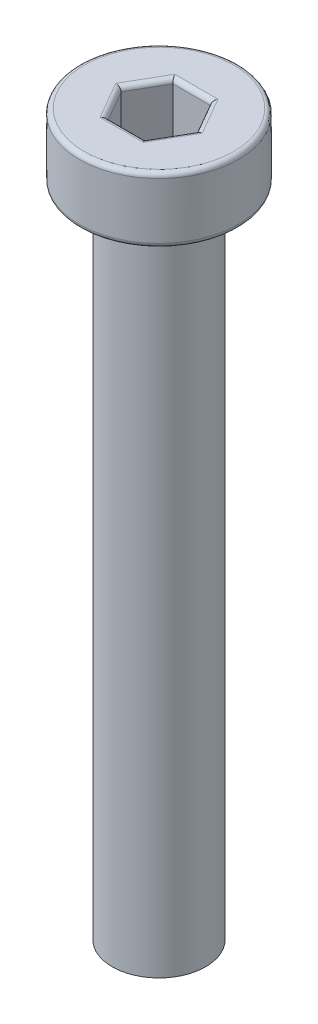
ISO-10303-21;
HEADER;
FILE_DESCRIPTION(('STEP AP214'),'2;1');
FILE_NAME('part.step','',(''),(''),'','','');
FILE_SCHEMA(('AUTOMOTIVE_DESIGN { 1 0 10303 214 1 1 1 1 }'));
ENDSEC;
DATA;
#1=APPLICATION_CONTEXT('core data for automotive mechanical design processes');
#2=APPLICATION_PROTOCOL_DEFINITION('international standard','automotive_design',2000,#1);
#3=PRODUCT_CONTEXT('',#1,'mechanical');
#4=PRODUCT('Part','Part','',(#3));
#5=PRODUCT_RELATED_PRODUCT_CATEGORY('part','',(#4));
#6=PRODUCT_DEFINITION_FORMATION('','',#4);
#7=PRODUCT_DEFINITION_CONTEXT('part definition',#1,'design');
#8=PRODUCT_DEFINITION('design','',#6,#7);
#9=PRODUCT_DEFINITION_SHAPE('','',#8);
#10=(LENGTH_UNIT() NAMED_UNIT(*) SI_UNIT(.MILLI.,.METRE.));
#11=(NAMED_UNIT(*) PLANE_ANGLE_UNIT() SI_UNIT($,.RADIAN.));
#12=(NAMED_UNIT(*) SI_UNIT($,.STERADIAN.) SOLID_ANGLE_UNIT());
#13=UNCERTAINTY_MEASURE_WITH_UNIT(LENGTH_MEASURE(1.E-05),#10,'distance_accuracy_value','');
#14=(GEOMETRIC_REPRESENTATION_CONTEXT(3) GLOBAL_UNCERTAINTY_ASSIGNED_CONTEXT((#13)) GLOBAL_UNIT_ASSIGNED_CONTEXT((#10,
#11,#12)) REPRESENTATION_CONTEXT('',''));
#15=CARTESIAN_POINT('',(0.,0.,0.));
#16=DIRECTION('',(0.,0.,1.));
#17=DIRECTION('',(1.,0.,0.));
#18=AXIS2_PLACEMENT_3D('',#15,#16,#17);
#19=CARTESIAN_POINT('',(2.45065328235741E-11,3.5,0.));
#20=DIRECTION('',(0.,-1.,0.));
#21=DIRECTION('',(1.,0.,0.));
#22=AXIS2_PLACEMENT_3D('',#19,#20,#21);
#23=PLANE('',#22);
#24=CARTESIAN_POINT('',(0.,3.5,0.));
#25=DIRECTION('',(0.,-1.,0.));
#26=DIRECTION('',(1.,0.,0.));
#27=AXIS2_PLACEMENT_3D('',#24,#25,#26);
#28=CIRCLE('',#27,4.0000000000245);
#29=CARTESIAN_POINT('',(4.0000000000245,3.5,0.));
#30=VERTEX_POINT('',#29);
#31=EDGE_CURVE('E179',#30,#30,#28,.F.);
#32=ORIENTED_EDGE('',*,*,#31,.T.);
#33=EDGE_LOOP('',(#32));
#34=FACE_BOUND('',#33,.T.);
#35=DIRECTION('',(-0.5,0.,0.866025403784439));
#36=VECTOR('',#35,1.);
#37=CARTESIAN_POINT('',(-1.73205080756275,3.5,-1.00000000001061));
#38=LINE('',#37,#36);
#39=CARTESIAN_POINT('',(-2.3094010767585,3.5,0.));
#40=VERTEX_POINT('',#39);
#41=CARTESIAN_POINT('',(-1.15470053837925,3.5,-2.));
#42=VERTEX_POINT('',#41);
#43=EDGE_CURVE('E174',#40,#42,#38,.F.);
#44=ORIENTED_EDGE('',*,*,#43,.T.);
#45=DIRECTION('',(-1.,0.,0.));
#46=VECTOR('',#45,1.);
#47=CARTESIAN_POINT('',(2.45071766726879E-11,3.5,-2.));
#48=LINE('',#47,#46);
#49=CARTESIAN_POINT('',(1.15470053837925,3.5,-2.));
#50=VERTEX_POINT('',#49);
#51=EDGE_CURVE('E176',#42,#50,#48,.F.);
#52=ORIENTED_EDGE('',*,*,#51,.T.);
#53=DIRECTION('',(-0.5,0.,-0.866025403784439));
#54=VECTOR('',#53,1.);
#55=CARTESIAN_POINT('',(1.732050807575,3.5,-0.999999999989388));
#56=LINE('',#55,#54);
#57=CARTESIAN_POINT('',(2.3094010767585,3.5,0.));
#58=VERTEX_POINT('',#57);
#59=EDGE_CURVE('E166',#50,#58,#56,.F.);
#60=ORIENTED_EDGE('',*,*,#59,.T.);
#61=DIRECTION('',(0.5,0.,-0.866025403784439));
#62=VECTOR('',#61,1.);
#63=CARTESIAN_POINT('',(1.732050807575,3.5,0.999999999989388));
#64=LINE('',#63,#62);
#65=CARTESIAN_POINT('',(1.15470053837925,3.5,2.));
#66=VERTEX_POINT('',#65);
#67=EDGE_CURVE('E168',#58,#66,#64,.F.);
#68=ORIENTED_EDGE('',*,*,#67,.T.);
#69=DIRECTION('',(1.,0.,0.));
#70=VECTOR('',#69,1.);
#71=CARTESIAN_POINT('',(2.45054597417179E-11,3.5,2.));
#72=LINE('',#71,#70);
#73=CARTESIAN_POINT('',(-1.15470053837925,3.5,2.));
#74=VERTEX_POINT('',#73);
#75=EDGE_CURVE('E170',#66,#74,#72,.F.);
#76=ORIENTED_EDGE('',*,*,#75,.T.);
#77=DIRECTION('',(0.5,0.,0.866025403784439));
#78=VECTOR('',#77,1.);
#79=CARTESIAN_POINT('',(-1.73205080756275,3.5,1.00000000001061));
#80=LINE('',#79,#78);
#81=EDGE_CURVE('E172',#74,#40,#80,.F.);
#82=ORIENTED_EDGE('',*,*,#81,.T.);
#83=EDGE_LOOP('',(#44,#52,#60,#68,#76,#82));
#84=FACE_BOUND('',#83,.T.);
#85=ADVANCED_FACE('F33',(#34,#84),#23,.F.);
#86=CARTESIAN_POINT('',(0.,21.3223243250921,0.));
#87=DIRECTION('',(0.,1.,0.));
#88=DIRECTION('',(-1.,0.,0.));
#89=AXIS2_PLACEMENT_3D('',#86,#87,#88);
#90=CYLINDRICAL_SURFACE('',#89,4.2500000000245);
#91=CARTESIAN_POINT('',(0.,0.25,0.));
#92=DIRECTION('',(0.,1.,0.));
#93=DIRECTION('',(-1.,0.,0.));
#94=AXIS2_PLACEMENT_3D('',#91,#92,#93);
#95=CIRCLE('',#94,4.2500000000245);
#96=CARTESIAN_POINT('',(-4.2500000000245,0.25,0.));
#97=VERTEX_POINT('',#96);
#98=EDGE_CURVE('E163',#97,#97,#95,.T.);
#99=ORIENTED_EDGE('',*,*,#98,.T.);
#100=EDGE_LOOP('',(#99));
#101=FACE_BOUND('',#100,.T.);
#102=CARTESIAN_POINT('',(0.,3.25,0.));
#103=DIRECTION('',(0.,-1.,0.));
#104=DIRECTION('',(1.,0.,0.));
#105=AXIS2_PLACEMENT_3D('',#102,#103,#104);
#106=CIRCLE('',#105,4.2500000000245);
#107=CARTESIAN_POINT('',(4.2500000000245,3.25,0.));
#108=VERTEX_POINT('',#107);
#109=EDGE_CURVE('E160',#108,#108,#106,.T.);
#110=ORIENTED_EDGE('',*,*,#109,.T.);
#111=EDGE_LOOP('',(#110));
#112=FACE_BOUND('',#111,.T.);
#113=ADVANCED_FACE('F240',(#101,#112),#90,.T.);
#114=CARTESIAN_POINT('',(4.2500000000245,0.,0.));
#115=DIRECTION('',(0.,1.,0.));
#116=DIRECTION('',(-1.,0.,0.));
#117=AXIS2_PLACEMENT_3D('',#114,#115,#116);
#118=PLANE('',#117);
#119=CARTESIAN_POINT('',(0.,0.,0.));
#120=DIRECTION('',(0.,1.,0.));
#121=DIRECTION('',(-1.,0.,0.));
#122=AXIS2_PLACEMENT_3D('',#119,#120,#121);
#123=CIRCLE('',#122,2.74999999997329);
#124=CARTESIAN_POINT('',(-2.74999999997329,0.,0.));
#125=VERTEX_POINT('',#124);
#126=EDGE_CURVE('E154',#125,#125,#123,.T.);
#127=ORIENTED_EDGE('',*,*,#126,.T.);
#128=EDGE_LOOP('',(#127));
#129=FACE_BOUND('',#128,.T.);
#130=CARTESIAN_POINT('',(0.,0.,0.));
#131=DIRECTION('',(0.,1.,0.));
#132=DIRECTION('',(-1.,0.,0.));
#133=AXIS2_PLACEMENT_3D('',#130,#131,#132);
#134=CIRCLE('',#133,4.0000000000245);
#135=CARTESIAN_POINT('',(-4.0000000000245,0.,0.));
#136=VERTEX_POINT('',#135);
#137=EDGE_CURVE('E151',#136,#136,#134,.F.);
#138=ORIENTED_EDGE('',*,*,#137,.T.);
#139=EDGE_LOOP('',(#138));
#140=FACE_BOUND('',#139,.T.);
#141=ADVANCED_FACE('F246',(#129,#140),#118,.F.);
#142=CARTESIAN_POINT('',(0.,21.3223243250921,0.));
#143=DIRECTION('',(0.,1.,0.));
#144=DIRECTION('',(-1.,0.,0.));
#145=AXIS2_PLACEMENT_3D('',#142,#143,#144);
#146=CYLINDRICAL_SURFACE('',#145,2.49999999997329);
#147=CARTESIAN_POINT('',(0.,-0.25,0.));
#148=DIRECTION('',(0.,1.,0.));
#149=DIRECTION('',(-1.,0.,0.));
#150=AXIS2_PLACEMENT_3D('',#147,#148,#149);
#151=CIRCLE('',#150,2.49999999997329);
#152=CARTESIAN_POINT('',(-2.49999999997329,-0.250000000000001,0.));
#153=VERTEX_POINT('',#152);
#154=EDGE_CURVE('E157',#153,#153,#151,.F.);
#155=ORIENTED_EDGE('',*,*,#154,.T.);
#156=EDGE_LOOP('',(#155));
#157=FACE_BOUND('',#156,.T.);
#158=CARTESIAN_POINT('',(0.,-35.,0.));
#159=DIRECTION('',(0.,1.,0.));
#160=DIRECTION('',(-1.,0.,0.));
#161=AXIS2_PLACEMENT_3D('',#158,#159,#160);
#162=CIRCLE('',#161,2.4999999999733);
#163=CARTESIAN_POINT('',(-2.49999999997329,-35.,0.));
#164=VERTEX_POINT('',#163);
#165=EDGE_CURVE('E139',#164,#164,#162,.T.);
#166=ORIENTED_EDGE('',*,*,#165,.T.);
#167=EDGE_LOOP('',(#166));
#168=FACE_BOUND('',#167,.T.);
#169=ADVANCED_FACE('F338',(#157,#168),#146,.T.);
#170=CARTESIAN_POINT('',(2.49999999997331,-35.,0.));
#171=DIRECTION('',(0.,1.,0.));
#172=DIRECTION('',(-1.,0.,0.));
#173=AXIS2_PLACEMENT_3D('',#170,#171,#172);
#174=PLANE('',#173);
#175=ORIENTED_EDGE('',*,*,#165,.F.);
#176=EDGE_LOOP('',(#175));
#177=FACE_BOUND('',#176,.T.);
#178=ADVANCED_FACE('F236',(#177),#174,.F.);
#179=CARTESIAN_POINT('',(1.01036297108184,0.5,1.75));
#180=DIRECTION('',(0.866025403784439,0.,0.5));
#181=DIRECTION('',(0.5,0.,-0.866025403784439));
#182=AXIS2_PLACEMENT_3D('',#179,#180,#181);
#183=PLANE('',#182);
#184=DIRECTION('',(0.,1.,0.));
#185=VECTOR('',#184,1.);
#186=CARTESIAN_POINT('',(1.01036297108184,0.5,1.75));
#187=LINE('',#186,#185);
#188=CARTESIAN_POINT('',(1.01036297108184,0.5,1.75));
#189=VERTEX_POINT('',#188);
#190=CARTESIAN_POINT('',(1.01036297108184,3.25,1.75));
#191=VERTEX_POINT('',#190);
#192=EDGE_CURVE('E137',#189,#191,#187,.T.);
#193=ORIENTED_EDGE('',*,*,#192,.T.);
#194=DIRECTION('',(0.5,0.,-0.866025403784439));
#195=VECTOR('',#194,1.);
#196=CARTESIAN_POINT('',(1.01036297108184,3.25,1.75));
#197=LINE('',#196,#195);
#198=CARTESIAN_POINT('',(2.02072594216369,3.25,0.));
#199=VERTEX_POINT('',#198);
#200=EDGE_CURVE('E42',#191,#199,#197,.T.);
#201=ORIENTED_EDGE('',*,*,#200,.T.);
#202=DIRECTION('',(0.,1.,0.));
#203=VECTOR('',#202,1.);
#204=CARTESIAN_POINT('',(2.02072594216369,0.5,0.));
#205=LINE('',#204,#203);
#206=CARTESIAN_POINT('',(2.02072594216369,0.5,0.));
#207=VERTEX_POINT('',#206);
#208=EDGE_CURVE('E103',#207,#199,#205,.T.);
#209=ORIENTED_EDGE('',*,*,#208,.F.);
#210=DIRECTION('',(0.5,0.,-0.866025403784439));
#211=VECTOR('',#210,1.);
#212=CARTESIAN_POINT('',(1.01036297108184,0.5,1.75));
#213=LINE('',#212,#211);
#214=EDGE_CURVE('E107',#189,#207,#213,.T.);
#215=ORIENTED_EDGE('',*,*,#214,.F.);
#216=EDGE_LOOP('',(#193,#201,#209,#215));
#217=FACE_BOUND('',#216,.T.);
#218=ADVANCED_FACE('F105',(#217),#183,.F.);
#219=CARTESIAN_POINT('',(-1.01036297108185,0.5,1.75));
#220=DIRECTION('',(0.,0.,1.));
#221=DIRECTION('',(1.,0.,0.));
#222=AXIS2_PLACEMENT_3D('',#219,#220,#221);
#223=PLANE('',#222);
#224=DIRECTION('',(0.,1.,0.));
#225=VECTOR('',#224,1.);
#226=CARTESIAN_POINT('',(-1.01036297108185,0.5,1.75));
#227=LINE('',#226,#225);
#228=CARTESIAN_POINT('',(-1.01036297108185,0.5,1.75));
#229=VERTEX_POINT('',#228);
#230=CARTESIAN_POINT('',(-1.01036297108185,3.25,1.75));
#231=VERTEX_POINT('',#230);
#232=EDGE_CURVE('E140',#229,#231,#227,.T.);
#233=ORIENTED_EDGE('',*,*,#232,.T.);
#234=DIRECTION('',(1.,0.,0.));
#235=VECTOR('',#234,1.);
#236=CARTESIAN_POINT('',(-1.01036297108185,3.25,1.75));
#237=LINE('',#236,#235);
#238=EDGE_CURVE('E57',#231,#191,#237,.T.);
#239=ORIENTED_EDGE('',*,*,#238,.T.);
#240=ORIENTED_EDGE('',*,*,#192,.F.);
#241=DIRECTION('',(1.,0.,0.));
#242=VECTOR('',#241,1.);
#243=CARTESIAN_POINT('',(-1.01036297108185,0.5,1.75));
#244=LINE('',#243,#242);
#245=EDGE_CURVE('E112',#229,#189,#244,.T.);
#246=ORIENTED_EDGE('',*,*,#245,.F.);
#247=EDGE_LOOP('',(#233,#239,#240,#246));
#248=FACE_BOUND('',#247,.T.);
#249=ADVANCED_FACE('F228',(#248),#223,.F.);
#250=CARTESIAN_POINT('',(-2.02072594216369,0.499999999999999,0.));
#251=DIRECTION('',(-0.866025403784439,0.,0.5));
#252=DIRECTION('',(0.5,0.,0.866025403784439));
#253=AXIS2_PLACEMENT_3D('',#250,#251,#252);
#254=PLANE('',#253);
#255=DIRECTION('',(0.,1.,0.));
#256=VECTOR('',#255,1.);
#257=CARTESIAN_POINT('',(-2.02072594216369,0.499999999999999,0.));
#258=LINE('',#257,#256);
#259=CARTESIAN_POINT('',(-2.02072594216369,0.499999999999999,0.));
#260=VERTEX_POINT('',#259);
#261=CARTESIAN_POINT('',(-2.02072594216369,3.25,0.));
#262=VERTEX_POINT('',#261);
#263=EDGE_CURVE('E142',#260,#262,#258,.T.);
#264=ORIENTED_EDGE('',*,*,#263,.T.);
#265=DIRECTION('',(0.5,0.,0.866025403784439));
#266=VECTOR('',#265,1.);
#267=CARTESIAN_POINT('',(-2.02072594216369,3.25,0.));
#268=LINE('',#267,#266);
#269=EDGE_CURVE('E187',#262,#231,#268,.T.);
#270=ORIENTED_EDGE('',*,*,#269,.T.);
#271=ORIENTED_EDGE('',*,*,#232,.F.);
#272=DIRECTION('',(0.5,0.,0.866025403784439));
#273=VECTOR('',#272,1.);
#274=CARTESIAN_POINT('',(-2.02072594216369,0.499999999999999,0.));
#275=LINE('',#274,#273);
#276=EDGE_CURVE('E134',#260,#229,#275,.T.);
#277=ORIENTED_EDGE('',*,*,#276,.F.);
#278=EDGE_LOOP('',(#264,#270,#271,#277));
#279=FACE_BOUND('',#278,.T.);
#280=ADVANCED_FACE('F227',(#279),#254,.F.);
#281=CARTESIAN_POINT('',(-1.01036297108185,0.5,-1.75));
#282=DIRECTION('',(-0.866025403784439,0.,-0.5));
#283=DIRECTION('',(-0.5,0.,0.866025403784439));
#284=AXIS2_PLACEMENT_3D('',#281,#282,#283);
#285=PLANE('',#284);
#286=DIRECTION('',(0.,1.,0.));
#287=VECTOR('',#286,1.);
#288=CARTESIAN_POINT('',(-1.01036297108185,0.5,-1.75));
#289=LINE('',#288,#287);
#290=CARTESIAN_POINT('',(-1.01036297108185,0.5,-1.75));
#291=VERTEX_POINT('',#290);
#292=CARTESIAN_POINT('',(-1.01036297108185,3.25,-1.75));
#293=VERTEX_POINT('',#292);
#294=EDGE_CURVE('E145',#291,#293,#289,.T.);
#295=ORIENTED_EDGE('',*,*,#294,.T.);
#296=DIRECTION('',(-0.5,0.,0.866025403784439));
#297=VECTOR('',#296,1.);
#298=CARTESIAN_POINT('',(-1.01036297108185,3.25,-1.75));
#299=LINE('',#298,#297);
#300=EDGE_CURVE('E185',#293,#262,#299,.T.);
#301=ORIENTED_EDGE('',*,*,#300,.T.);
#302=ORIENTED_EDGE('',*,*,#263,.F.);
#303=DIRECTION('',(-0.5,0.,0.866025403784439));
#304=VECTOR('',#303,1.);
#305=CARTESIAN_POINT('',(-1.01036297108185,0.5,-1.75));
#306=LINE('',#305,#304);
#307=EDGE_CURVE('E131',#291,#260,#306,.T.);
#308=ORIENTED_EDGE('',*,*,#307,.F.);
#309=EDGE_LOOP('',(#295,#301,#302,#308));
#310=FACE_BOUND('',#309,.T.);
#311=ADVANCED_FACE('F224',(#310),#285,.F.);
#312=CARTESIAN_POINT('',(1.01036297108185,0.5,-1.75));
#313=DIRECTION('',(0.,0.,-1.));
#314=DIRECTION('',(-1.,0.,0.));
#315=AXIS2_PLACEMENT_3D('',#312,#313,#314);
#316=PLANE('',#315);
#317=DIRECTION('',(0.,1.,0.));
#318=VECTOR('',#317,1.);
#319=CARTESIAN_POINT('',(1.01036297108185,0.5,-1.75));
#320=LINE('',#319,#318);
#321=CARTESIAN_POINT('',(1.01036297108185,0.5,-1.75));
#322=VERTEX_POINT('',#321);
#323=CARTESIAN_POINT('',(1.01036297108184,3.25,-1.75));
#324=VERTEX_POINT('',#323);
#325=EDGE_CURVE('E111',#322,#324,#320,.T.);
#326=ORIENTED_EDGE('',*,*,#325,.T.);
#327=DIRECTION('',(-1.,0.,0.));
#328=VECTOR('',#327,1.);
#329=CARTESIAN_POINT('',(1.01036297108184,3.25,-1.75));
#330=LINE('',#329,#328);
#331=EDGE_CURVE('E182',#324,#293,#330,.T.);
#332=ORIENTED_EDGE('',*,*,#331,.T.);
#333=ORIENTED_EDGE('',*,*,#294,.F.);
#334=DIRECTION('',(-1.,0.,0.));
#335=VECTOR('',#334,1.);
#336=CARTESIAN_POINT('',(1.01036297108185,0.5,-1.75));
#337=LINE('',#336,#335);
#338=EDGE_CURVE('E121',#322,#291,#337,.T.);
#339=ORIENTED_EDGE('',*,*,#338,.F.);
#340=EDGE_LOOP('',(#326,#332,#333,#339));
#341=FACE_BOUND('',#340,.T.);
#342=ADVANCED_FACE('F220',(#341),#316,.F.);
#343=CARTESIAN_POINT('',(2.02072594216369,0.5,0.));
#344=DIRECTION('',(0.866025403784439,0.,-0.5));
#345=DIRECTION('',(-0.5,0.,-0.866025403784439));
#346=AXIS2_PLACEMENT_3D('',#343,#344,#345);
#347=PLANE('',#346);
#348=ORIENTED_EDGE('',*,*,#208,.T.);
#349=DIRECTION('',(-0.5,0.,-0.866025403784439));
#350=VECTOR('',#349,1.);
#351=CARTESIAN_POINT('',(2.02072594216369,3.25,0.));
#352=LINE('',#351,#350);
#353=EDGE_CURVE('E11',#199,#324,#352,.T.);
#354=ORIENTED_EDGE('',*,*,#353,.T.);
#355=ORIENTED_EDGE('',*,*,#325,.F.);
#356=DIRECTION('',(-0.5,0.,-0.866025403784439));
#357=VECTOR('',#356,1.);
#358=CARTESIAN_POINT('',(2.02072594216369,0.5,0.));
#359=LINE('',#358,#357);
#360=EDGE_CURVE('E115',#207,#322,#359,.T.);
#361=ORIENTED_EDGE('',*,*,#360,.F.);
#362=EDGE_LOOP('',(#348,#354,#355,#361));
#363=FACE_BOUND('',#362,.T.);
#364=ADVANCED_FACE('F116',(#363),#347,.F.);
#365=CARTESIAN_POINT('',(0.,0.499999999999999,0.));
#366=DIRECTION('',(0.,1.,0.));
#367=DIRECTION('',(-1.,0.,0.));
#368=AXIS2_PLACEMENT_3D('',#365,#366,#367);
#369=PLANE('',#368);
#370=ORIENTED_EDGE('',*,*,#214,.T.);
#371=ORIENTED_EDGE('',*,*,#360,.T.);
#372=ORIENTED_EDGE('',*,*,#338,.T.);
#373=ORIENTED_EDGE('',*,*,#307,.T.);
#374=ORIENTED_EDGE('',*,*,#276,.T.);
#375=ORIENTED_EDGE('',*,*,#245,.T.);
#376=EDGE_LOOP('',(#370,#371,#372,#373,#374,#375));
#377=FACE_BOUND('',#376,.T.);
#378=ADVANCED_FACE('F123',(#377),#369,.T.);
#379=CARTESIAN_POINT('',(0.,-0.25,0.));
#380=DIRECTION('',(0.,1.,0.));
#381=DIRECTION('',(-1.,0.,0.));
#382=AXIS2_PLACEMENT_3D('',#379,#380,#381);
#383=TOROIDAL_SURFACE('',#382,2.74999999997329,0.25);
#384=ORIENTED_EDGE('',*,*,#154,.F.);
#385=EDGE_LOOP('',(#384));
#386=FACE_BOUND('',#385,.T.);
#387=ORIENTED_EDGE('',*,*,#126,.F.);
#388=EDGE_LOOP('',(#387));
#389=FACE_BOUND('',#388,.T.);
#390=ADVANCED_FACE('F252',(#386,#389),#383,.F.);
#391=CARTESIAN_POINT('',(0.,0.25,0.));
#392=DIRECTION('',(0.,1.,0.));
#393=DIRECTION('',(-1.,0.,0.));
#394=AXIS2_PLACEMENT_3D('',#391,#392,#393);
#395=TOROIDAL_SURFACE('',#394,4.0000000000245,0.25);
#396=ORIENTED_EDGE('',*,*,#137,.F.);
#397=EDGE_LOOP('',(#396));
#398=FACE_BOUND('',#397,.T.);
#399=ORIENTED_EDGE('',*,*,#98,.F.);
#400=EDGE_LOOP('',(#399));
#401=FACE_BOUND('',#400,.T.);
#402=ADVANCED_FACE('F255',(#398,#401),#395,.T.);
#403=CARTESIAN_POINT('',(0.,3.25,0.));
#404=DIRECTION('',(0.,-1.,0.));
#405=DIRECTION('',(1.,0.,0.));
#406=AXIS2_PLACEMENT_3D('',#403,#404,#405);
#407=TOROIDAL_SURFACE('',#406,4.0000000000245,0.25);
#408=ORIENTED_EDGE('',*,*,#109,.F.);
#409=EDGE_LOOP('',(#408));
#410=FACE_BOUND('',#409,.T.);
#411=ORIENTED_EDGE('',*,*,#31,.F.);
#412=EDGE_LOOP('',(#411));
#413=FACE_BOUND('',#412,.T.);
#414=ADVANCED_FACE('F259',(#410,#413),#407,.T.);
#415=CARTESIAN_POINT('',(-1.01036297108185,3.25,2.));
#416=DIRECTION('',(1.,0.,0.));
#417=DIRECTION('',(0.,0.,-1.));
#418=AXIS2_PLACEMENT_3D('',#415,#416,#417);
#419=CYLINDRICAL_SURFACE('',#418,0.25);
#420=CARTESIAN_POINT('',(-1.15470053837925,3.25,2.));
#421=DIRECTION('',(0.866025403784438,0.,0.500000000000001));
#422=DIRECTION('',(-0.5,0.,0.866025403784438));
#423=AXIS2_PLACEMENT_3D('',#420,#421,#422);
#424=ELLIPSE('',#423,0.288675134594813,0.25);
#425=EDGE_CURVE('E128',#74,#231,#424,.F.);
#426=ORIENTED_EDGE('',*,*,#425,.F.);
#427=ORIENTED_EDGE('',*,*,#75,.F.);
#428=CARTESIAN_POINT('',(1.15470053837925,3.25,2.));
#429=DIRECTION('',(0.866025403784439,0.,-0.5));
#430=DIRECTION('',(0.5,0.,0.866025403784439));
#431=AXIS2_PLACEMENT_3D('',#428,#429,#430);
#432=ELLIPSE('',#431,0.288675134594813,0.25);
#433=EDGE_CURVE('E37',#191,#66,#432,.T.);
#434=ORIENTED_EDGE('',*,*,#433,.F.);
#435=ORIENTED_EDGE('',*,*,#238,.F.);
#436=EDGE_LOOP('',(#426,#427,#434,#435));
#437=FACE_BOUND('',#436,.T.);
#438=ADVANCED_FACE('F35',(#437),#419,.T.);
#439=CARTESIAN_POINT('',(1.22686932202795,3.25,1.875));
#440=DIRECTION('',(0.5,0.,-0.866025403784439));
#441=DIRECTION('',(-0.866025403784439,0.,-0.5));
#442=AXIS2_PLACEMENT_3D('',#439,#440,#441);
#443=CYLINDRICAL_SURFACE('',#442,0.25);
#444=ORIENTED_EDGE('',*,*,#433,.T.);
#445=ORIENTED_EDGE('',*,*,#67,.F.);
#446=CARTESIAN_POINT('',(2.3094010767585,3.25,0.));
#447=DIRECTION('',(0.,0.,-1.));
#448=DIRECTION('',(1.,0.,0.));
#449=AXIS2_PLACEMENT_3D('',#446,#447,#448);
#450=ELLIPSE('',#449,0.288675134594813,0.25);
#451=EDGE_CURVE('E198',#199,#58,#450,.T.);
#452=ORIENTED_EDGE('',*,*,#451,.F.);
#453=ORIENTED_EDGE('',*,*,#200,.F.);
#454=EDGE_LOOP('',(#444,#445,#452,#453));
#455=FACE_BOUND('',#454,.T.);
#456=ADVANCED_FACE('F212',(#455),#443,.T.);
#457=CARTESIAN_POINT('',(-2.2372322931098,3.25,0.124999999999999));
#458=DIRECTION('',(0.5,0.,0.866025403784439));
#459=DIRECTION('',(0.866025403784439,0.,-0.5));
#460=AXIS2_PLACEMENT_3D('',#457,#458,#459);
#461=CYLINDRICAL_SURFACE('',#460,0.25);
#462=ORIENTED_EDGE('',*,*,#425,.T.);
#463=ORIENTED_EDGE('',*,*,#269,.F.);
#464=CARTESIAN_POINT('',(-2.3094010767585,3.25,0.));
#465=DIRECTION('',(0.,0.,1.));
#466=DIRECTION('',(-1.,0.,0.));
#467=AXIS2_PLACEMENT_3D('',#464,#465,#466);
#468=ELLIPSE('',#467,0.288675134594813,0.25);
#469=EDGE_CURVE('E195',#40,#262,#468,.F.);
#470=ORIENTED_EDGE('',*,*,#469,.F.);
#471=ORIENTED_EDGE('',*,*,#81,.F.);
#472=EDGE_LOOP('',(#462,#463,#470,#471));
#473=FACE_BOUND('',#472,.T.);
#474=ADVANCED_FACE('F205',(#473),#461,.T.);
#475=CARTESIAN_POINT('',(2.2372322931098,3.25,-0.125));
#476=DIRECTION('',(-0.5,0.,-0.866025403784439));
#477=DIRECTION('',(-0.866025403784439,0.,0.5));
#478=AXIS2_PLACEMENT_3D('',#475,#476,#477);
#479=CYLINDRICAL_SURFACE('',#478,0.25);
#480=ORIENTED_EDGE('',*,*,#451,.T.);
#481=ORIENTED_EDGE('',*,*,#59,.F.);
#482=CARTESIAN_POINT('',(1.15470053837925,3.25,-2.));
#483=DIRECTION('',(-0.866025403784438,0.,-0.5));
#484=DIRECTION('',(-0.5,0.,0.866025403784439));
#485=AXIS2_PLACEMENT_3D('',#482,#483,#484);
#486=ELLIPSE('',#485,0.288675134594813,0.25);
#487=EDGE_CURVE('E193',#324,#50,#486,.T.);
#488=ORIENTED_EDGE('',*,*,#487,.F.);
#489=ORIENTED_EDGE('',*,*,#353,.F.);
#490=EDGE_LOOP('',(#480,#481,#488,#489));
#491=FACE_BOUND('',#490,.T.);
#492=ADVANCED_FACE('F217',(#491),#479,.T.);
#493=CARTESIAN_POINT('',(-1.22686932202796,3.25,-1.875));
#494=DIRECTION('',(-0.5,0.,0.866025403784439));
#495=DIRECTION('',(0.866025403784439,0.,0.5));
#496=AXIS2_PLACEMENT_3D('',#493,#494,#495);
#497=CYLINDRICAL_SURFACE('',#496,0.25);
#498=ORIENTED_EDGE('',*,*,#469,.T.);
#499=ORIENTED_EDGE('',*,*,#300,.F.);
#500=CARTESIAN_POINT('',(-1.15470053837925,3.25,-2.));
#501=DIRECTION('',(-0.866025403784439,0.,0.5));
#502=DIRECTION('',(-0.5,0.,-0.866025403784439));
#503=AXIS2_PLACEMENT_3D('',#500,#501,#502);
#504=ELLIPSE('',#503,0.288675134594813,0.25);
#505=EDGE_CURVE('E191',#42,#293,#504,.F.);
#506=ORIENTED_EDGE('',*,*,#505,.F.);
#507=ORIENTED_EDGE('',*,*,#43,.F.);
#508=EDGE_LOOP('',(#498,#499,#506,#507));
#509=FACE_BOUND('',#508,.T.);
#510=ADVANCED_FACE('F267',(#509),#497,.T.);
#511=CARTESIAN_POINT('',(1.01036297108184,3.25,-2.));
#512=DIRECTION('',(-1.,0.,0.));
#513=DIRECTION('',(0.,0.,1.));
#514=AXIS2_PLACEMENT_3D('',#511,#512,#513);
#515=CYLINDRICAL_SURFACE('',#514,0.25);
#516=ORIENTED_EDGE('',*,*,#487,.T.);
#517=ORIENTED_EDGE('',*,*,#51,.F.);
#518=ORIENTED_EDGE('',*,*,#505,.T.);
#519=ORIENTED_EDGE('',*,*,#331,.F.);
#520=EDGE_LOOP('',(#516,#517,#518,#519));
#521=FACE_BOUND('',#520,.T.);
#522=ADVANCED_FACE('F264',(#521),#515,.T.);
#523=CLOSED_SHELL('',(#85,#113,#141,#169,#178,#218,#249,#280,#311,#342,#364,#378,#390,#402,#414,
#438,#456,#474,#492,#510,#522));
#524=MANIFOLD_SOLID_BREP('B2',#523);
#525=ADVANCED_BREP_SHAPE_REPRESENTATION('',(#18,#524),#14);
#526=SHAPE_DEFINITION_REPRESENTATION(#9,#525);
ENDSEC;
END-ISO-10303-21;
